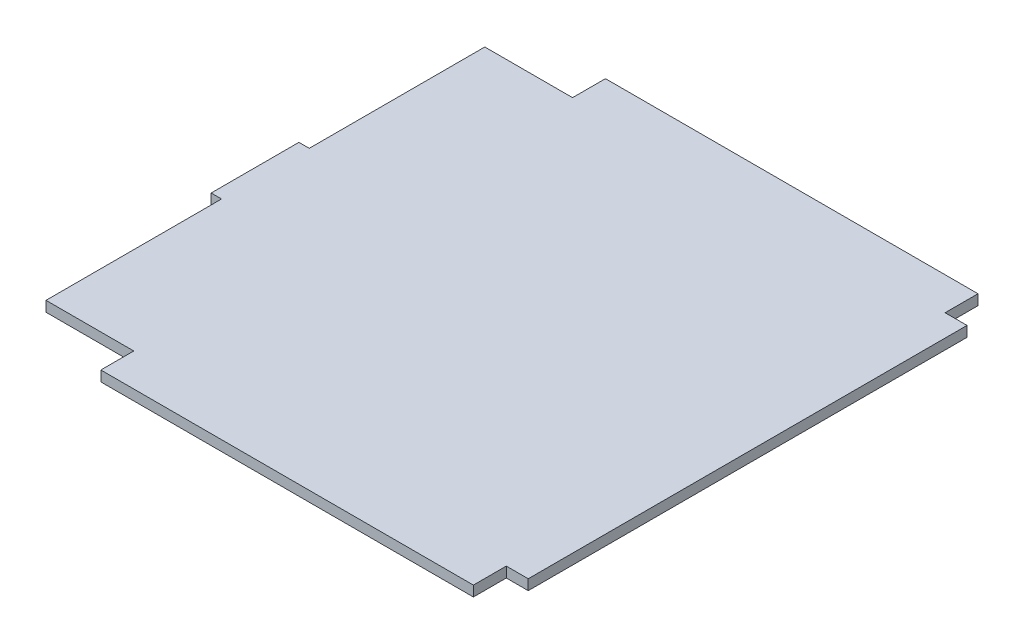
ISO-10303-21;
HEADER;
FILE_DESCRIPTION(('STEP AP214'),'2;1');
FILE_NAME('part.step','',(''),(''),'','','');
FILE_SCHEMA(('AUTOMOTIVE_DESIGN { 1 0 10303 214 1 1 1 1 }'));
ENDSEC;
DATA;
#1=APPLICATION_CONTEXT('core data for automotive mechanical design processes');
#2=APPLICATION_PROTOCOL_DEFINITION('international standard','automotive_design',2000,#1);
#3=PRODUCT_CONTEXT('',#1,'mechanical');
#4=PRODUCT('Part','Part','',(#3));
#5=PRODUCT_RELATED_PRODUCT_CATEGORY('part','',(#4));
#6=PRODUCT_DEFINITION_FORMATION('','',#4);
#7=PRODUCT_DEFINITION_CONTEXT('part definition',#1,'design');
#8=PRODUCT_DEFINITION('design','',#6,#7);
#9=PRODUCT_DEFINITION_SHAPE('','',#8);
#10=(LENGTH_UNIT() NAMED_UNIT(*) SI_UNIT(.MILLI.,.METRE.));
#11=(NAMED_UNIT(*) PLANE_ANGLE_UNIT() SI_UNIT($,.RADIAN.));
#12=(NAMED_UNIT(*) SI_UNIT($,.STERADIAN.) SOLID_ANGLE_UNIT());
#13=UNCERTAINTY_MEASURE_WITH_UNIT(LENGTH_MEASURE(1.E-05),#10,'distance_accuracy_value','');
#14=(GEOMETRIC_REPRESENTATION_CONTEXT(3) GLOBAL_UNCERTAINTY_ASSIGNED_CONTEXT((#13)) GLOBAL_UNIT_ASSIGNED_CONTEXT((#10,
#11,#12)) REPRESENTATION_CONTEXT('',''));
#15=CARTESIAN_POINT('',(0.,0.,0.));
#16=DIRECTION('',(0.,0.,1.));
#17=DIRECTION('',(1.,0.,0.));
#18=AXIS2_PLACEMENT_3D('',#15,#16,#17);
#19=CARTESIAN_POINT('',(0.,2.9972,73.025));
#20=DIRECTION('',(0.,0.,1.));
#21=DIRECTION('',(1.,0.,0.));
#22=AXIS2_PLACEMENT_3D('',#19,#20,#21);
#23=PLANE('',#22);
#24=DIRECTION('',(-1.,0.,0.));
#25=VECTOR('',#24,1.);
#26=CARTESIAN_POINT('',(0.,0.,73.025));
#27=LINE('',#26,#25);
#28=CARTESIAN_POINT('',(63.4365000000001,0.,73.025));
#29=VERTEX_POINT('',#28);
#30=CARTESIAN_POINT('',(-44.3864999999999,0.,73.025));
#31=VERTEX_POINT('',#30);
#32=EDGE_CURVE('E250',#29,#31,#27,.T.);
#33=ORIENTED_EDGE('',*,*,#32,.F.);
#34=DIRECTION('',(0.,-1.,0.));
#35=VECTOR('',#34,1.);
#36=CARTESIAN_POINT('',(63.4365000000001,2.9972,73.025));
#37=LINE('',#36,#35);
#38=CARTESIAN_POINT('',(63.4365000000001,2.9972,73.025));
#39=VERTEX_POINT('',#38);
#40=EDGE_CURVE('E11',#39,#29,#37,.T.);
#41=ORIENTED_EDGE('',*,*,#40,.F.);
#42=DIRECTION('',(-1.,0.,0.));
#43=VECTOR('',#42,1.);
#44=CARTESIAN_POINT('',(0.,2.9972,73.025));
#45=LINE('',#44,#43);
#46=CARTESIAN_POINT('',(-44.3864999999999,2.9972,73.025));
#47=VERTEX_POINT('',#46);
#48=EDGE_CURVE('E205',#39,#47,#45,.T.);
#49=ORIENTED_EDGE('',*,*,#48,.T.);
#50=DIRECTION('',(0.,-1.,0.));
#51=VECTOR('',#50,1.);
#52=CARTESIAN_POINT('',(-44.3864999999999,2.9972,73.025));
#53=LINE('',#52,#51);
#54=EDGE_CURVE('E52',#47,#31,#53,.T.);
#55=ORIENTED_EDGE('',*,*,#54,.T.);
#56=EDGE_LOOP('',(#33,#41,#49,#55));
#57=FACE_BOUND('',#56,.T.);
#58=ADVANCED_FACE('F36',(#57),#23,.T.);
#59=CARTESIAN_POINT('',(63.4365000000001,2.9972,0.));
#60=DIRECTION('',(-1.,0.,0.));
#61=DIRECTION('',(0.,0.,1.));
#62=AXIS2_PLACEMENT_3D('',#59,#60,#61);
#63=PLANE('',#62);
#64=DIRECTION('',(0.,0.,-1.));
#65=VECTOR('',#64,1.);
#66=CARTESIAN_POINT('',(63.4365000000001,0.,0.));
#67=LINE('',#66,#65);
#68=CARTESIAN_POINT('',(63.4365000000001,0.,63.5));
#69=VERTEX_POINT('',#68);
#70=EDGE_CURVE('E248',#29,#69,#67,.T.);
#71=ORIENTED_EDGE('',*,*,#70,.T.);
#72=DIRECTION('',(0.,-1.,0.));
#73=VECTOR('',#72,1.);
#74=CARTESIAN_POINT('',(63.4365000000001,2.9972,63.5));
#75=LINE('',#74,#73);
#76=CARTESIAN_POINT('',(63.4365000000001,2.9972,63.5));
#77=VERTEX_POINT('',#76);
#78=EDGE_CURVE('E44',#77,#69,#75,.T.);
#79=ORIENTED_EDGE('',*,*,#78,.F.);
#80=DIRECTION('',(0.,0.,-1.));
#81=VECTOR('',#80,1.);
#82=CARTESIAN_POINT('',(63.4365000000001,2.9972,0.));
#83=LINE('',#82,#81);
#84=EDGE_CURVE('E203',#39,#77,#83,.T.);
#85=ORIENTED_EDGE('',*,*,#84,.F.);
#86=ORIENTED_EDGE('',*,*,#40,.T.);
#87=EDGE_LOOP('',(#71,#79,#85,#86));
#88=FACE_BOUND('',#87,.T.);
#89=ADVANCED_FACE('F249',(#88),#63,.F.);
#90=CARTESIAN_POINT('',(-5.55111512312574E-13,2.9972,63.4999999999994));
#91=DIRECTION('',(0.,0.,1.));
#92=DIRECTION('',(1.,0.,0.));
#93=AXIS2_PLACEMENT_3D('',#90,#91,#92);
#94=PLANE('',#93);
#95=DIRECTION('',(-1.,0.,0.));
#96=VECTOR('',#95,1.);
#97=CARTESIAN_POINT('',(-5.55111512312574E-13,0.,63.4999999999994));
#98=LINE('',#97,#96);
#99=CARTESIAN_POINT('',(69.7865000000001,0.,63.5));
#100=VERTEX_POINT('',#99);
#101=EDGE_CURVE('E244',#100,#69,#98,.T.);
#102=ORIENTED_EDGE('',*,*,#101,.F.);
#103=DIRECTION('',(0.,-1.,0.));
#104=VECTOR('',#103,1.);
#105=CARTESIAN_POINT('',(69.7865000000001,2.9972,63.5));
#106=LINE('',#105,#104);
#107=CARTESIAN_POINT('',(69.7865000000001,2.9972,63.5));
#108=VERTEX_POINT('',#107);
#109=EDGE_CURVE('E237',#108,#100,#106,.T.);
#110=ORIENTED_EDGE('',*,*,#109,.F.);
#111=DIRECTION('',(-1.,0.,0.));
#112=VECTOR('',#111,1.);
#113=CARTESIAN_POINT('',(-5.55111512312574E-13,2.9972,63.4999999999994));
#114=LINE('',#113,#112);
#115=EDGE_CURVE('E200',#108,#77,#114,.T.);
#116=ORIENTED_EDGE('',*,*,#115,.T.);
#117=ORIENTED_EDGE('',*,*,#78,.T.);
#118=EDGE_LOOP('',(#102,#110,#116,#117));
#119=FACE_BOUND('',#118,.T.);
#120=ADVANCED_FACE('F242',(#119),#94,.T.);
#121=CARTESIAN_POINT('',(69.7865000000001,2.9972,0.));
#122=DIRECTION('',(-1.,0.,0.));
#123=DIRECTION('',(0.,0.,1.));
#124=AXIS2_PLACEMENT_3D('',#121,#122,#123);
#125=PLANE('',#124);
#126=DIRECTION('',(0.,0.,-1.));
#127=VECTOR('',#126,1.);
#128=CARTESIAN_POINT('',(69.7865000000001,0.,0.));
#129=LINE('',#128,#127);
#130=CARTESIAN_POINT('',(69.7865000000001,0.,-63.5));
#131=VERTEX_POINT('',#130);
#132=EDGE_CURVE('E255',#100,#131,#129,.T.);
#133=ORIENTED_EDGE('',*,*,#132,.T.);
#134=DIRECTION('',(0.,-1.,0.));
#135=VECTOR('',#134,1.);
#136=CARTESIAN_POINT('',(69.7865000000001,2.9972,-63.5));
#137=LINE('',#136,#135);
#138=CARTESIAN_POINT('',(69.7865000000001,2.9972,-63.5));
#139=VERTEX_POINT('',#138);
#140=EDGE_CURVE('E234',#139,#131,#137,.T.);
#141=ORIENTED_EDGE('',*,*,#140,.F.);
#142=DIRECTION('',(0.,0.,-1.));
#143=VECTOR('',#142,1.);
#144=CARTESIAN_POINT('',(69.7865000000001,2.9972,0.));
#145=LINE('',#144,#143);
#146=EDGE_CURVE('E198',#108,#139,#145,.T.);
#147=ORIENTED_EDGE('',*,*,#146,.F.);
#148=ORIENTED_EDGE('',*,*,#109,.T.);
#149=EDGE_LOOP('',(#133,#141,#147,#148));
#150=FACE_BOUND('',#149,.T.);
#151=ADVANCED_FACE('F321',(#150),#125,.F.);
#152=CARTESIAN_POINT('',(-2.77555756156288E-13,2.9972,-63.4999999999997));
#153=DIRECTION('',(0.,0.,1.));
#154=DIRECTION('',(1.,0.,0.));
#155=AXIS2_PLACEMENT_3D('',#152,#153,#154);
#156=PLANE('',#155);
#157=DIRECTION('',(-1.,0.,0.));
#158=VECTOR('',#157,1.);
#159=CARTESIAN_POINT('',(-2.77555756156288E-13,0.,-63.4999999999997));
#160=LINE('',#159,#158);
#161=CARTESIAN_POINT('',(63.4365000000001,0.,-63.5));
#162=VERTEX_POINT('',#161);
#163=EDGE_CURVE('E257',#131,#162,#160,.T.);
#164=ORIENTED_EDGE('',*,*,#163,.T.);
#165=DIRECTION('',(0.,-1.,0.));
#166=VECTOR('',#165,1.);
#167=CARTESIAN_POINT('',(63.4365000000001,2.9972,-63.5));
#168=LINE('',#167,#166);
#169=CARTESIAN_POINT('',(63.4365000000001,2.9972,-63.5));
#170=VERTEX_POINT('',#169);
#171=EDGE_CURVE('E232',#170,#162,#168,.T.);
#172=ORIENTED_EDGE('',*,*,#171,.F.);
#173=DIRECTION('',(-1.,0.,0.));
#174=VECTOR('',#173,1.);
#175=CARTESIAN_POINT('',(-2.77555756156288E-13,2.9972,-63.4999999999997));
#176=LINE('',#175,#174);
#177=EDGE_CURVE('E196',#139,#170,#176,.T.);
#178=ORIENTED_EDGE('',*,*,#177,.F.);
#179=ORIENTED_EDGE('',*,*,#140,.T.);
#180=EDGE_LOOP('',(#164,#172,#178,#179));
#181=FACE_BOUND('',#180,.T.);
#182=ADVANCED_FACE('F316',(#181),#156,.F.);
#183=CARTESIAN_POINT('',(63.4365000000001,2.9972,0.));
#184=DIRECTION('',(1.,0.,0.));
#185=DIRECTION('',(0.,0.,-1.));
#186=AXIS2_PLACEMENT_3D('',#183,#184,#185);
#187=PLANE('',#186);
#188=DIRECTION('',(0.,0.,1.));
#189=VECTOR('',#188,1.);
#190=CARTESIAN_POINT('',(63.4365000000001,0.,0.));
#191=LINE('',#190,#189);
#192=CARTESIAN_POINT('',(63.4365000000001,0.,-73.025));
#193=VERTEX_POINT('',#192);
#194=EDGE_CURVE('E263',#193,#162,#191,.T.);
#195=ORIENTED_EDGE('',*,*,#194,.F.);
#196=DIRECTION('',(0.,-1.,0.));
#197=VECTOR('',#196,1.);
#198=CARTESIAN_POINT('',(63.4365000000001,2.9972,-73.025));
#199=LINE('',#198,#197);
#200=CARTESIAN_POINT('',(63.4365000000001,2.9972,-73.025));
#201=VERTEX_POINT('',#200);
#202=EDGE_CURVE('E230',#201,#193,#199,.T.);
#203=ORIENTED_EDGE('',*,*,#202,.F.);
#204=DIRECTION('',(0.,0.,1.));
#205=VECTOR('',#204,1.);
#206=CARTESIAN_POINT('',(63.4365000000001,2.9972,0.));
#207=LINE('',#206,#205);
#208=EDGE_CURVE('E193',#201,#170,#207,.T.);
#209=ORIENTED_EDGE('',*,*,#208,.T.);
#210=ORIENTED_EDGE('',*,*,#171,.T.);
#211=EDGE_LOOP('',(#195,#203,#209,#210));
#212=FACE_BOUND('',#211,.T.);
#213=ADVANCED_FACE('F313',(#212),#187,.T.);
#214=CARTESIAN_POINT('',(0.,2.9972,-73.025));
#215=DIRECTION('',(0.,0.,1.));
#216=DIRECTION('',(1.,0.,0.));
#217=AXIS2_PLACEMENT_3D('',#214,#215,#216);
#218=PLANE('',#217);
#219=DIRECTION('',(-1.,0.,0.));
#220=VECTOR('',#219,1.);
#221=CARTESIAN_POINT('',(0.,0.,-73.025));
#222=LINE('',#221,#220);
#223=CARTESIAN_POINT('',(-44.3864999999999,0.,-73.025));
#224=VERTEX_POINT('',#223);
#225=EDGE_CURVE('E266',#193,#224,#222,.T.);
#226=ORIENTED_EDGE('',*,*,#225,.T.);
#227=DIRECTION('',(0.,-1.,0.));
#228=VECTOR('',#227,1.);
#229=CARTESIAN_POINT('',(-44.3864999999999,2.9972,-73.025));
#230=LINE('',#229,#228);
#231=CARTESIAN_POINT('',(-44.3864999999999,2.9972,-73.025));
#232=VERTEX_POINT('',#231);
#233=EDGE_CURVE('E227',#232,#224,#230,.T.);
#234=ORIENTED_EDGE('',*,*,#233,.F.);
#235=DIRECTION('',(-1.,0.,0.));
#236=VECTOR('',#235,1.);
#237=CARTESIAN_POINT('',(0.,2.9972,-73.025));
#238=LINE('',#237,#236);
#239=EDGE_CURVE('E189',#201,#232,#238,.T.);
#240=ORIENTED_EDGE('',*,*,#239,.F.);
#241=ORIENTED_EDGE('',*,*,#202,.T.);
#242=EDGE_LOOP('',(#226,#234,#240,#241));
#243=FACE_BOUND('',#242,.T.);
#244=ADVANCED_FACE('F310',(#243),#218,.F.);
#245=CARTESIAN_POINT('',(-44.3864999999999,2.9972,0.));
#246=DIRECTION('',(1.,0.,0.));
#247=DIRECTION('',(0.,0.,-1.));
#248=AXIS2_PLACEMENT_3D('',#245,#246,#247);
#249=PLANE('',#248);
#250=DIRECTION('',(0.,0.,1.));
#251=VECTOR('',#250,1.);
#252=CARTESIAN_POINT('',(-44.3864999999999,0.,0.));
#253=LINE('',#252,#251);
#254=CARTESIAN_POINT('',(-44.3864999999999,0.,-63.5));
#255=VERTEX_POINT('',#254);
#256=EDGE_CURVE('E268',#224,#255,#253,.T.);
#257=ORIENTED_EDGE('',*,*,#256,.T.);
#258=DIRECTION('',(0.,-1.,0.));
#259=VECTOR('',#258,1.);
#260=CARTESIAN_POINT('',(-44.3864999999999,2.9972,-63.5));
#261=LINE('',#260,#259);
#262=CARTESIAN_POINT('',(-44.3864999999999,2.9972,-63.5));
#263=VERTEX_POINT('',#262);
#264=EDGE_CURVE('E225',#263,#255,#261,.T.);
#265=ORIENTED_EDGE('',*,*,#264,.F.);
#266=DIRECTION('',(0.,0.,1.));
#267=VECTOR('',#266,1.);
#268=CARTESIAN_POINT('',(-44.3864999999999,2.9972,0.));
#269=LINE('',#268,#267);
#270=EDGE_CURVE('E186',#232,#263,#269,.T.);
#271=ORIENTED_EDGE('',*,*,#270,.F.);
#272=ORIENTED_EDGE('',*,*,#233,.T.);
#273=EDGE_LOOP('',(#257,#265,#271,#272));
#274=FACE_BOUND('',#273,.T.);
#275=ADVANCED_FACE('F305',(#274),#249,.F.);
#276=CARTESIAN_POINT('',(0.,2.9972,-63.5));
#277=DIRECTION('',(0.,0.,-1.));
#278=DIRECTION('',(-1.,0.,0.));
#279=AXIS2_PLACEMENT_3D('',#276,#277,#278);
#280=PLANE('',#279);
#281=DIRECTION('',(1.,0.,0.));
#282=VECTOR('',#281,1.);
#283=CARTESIAN_POINT('',(0.,0.,-63.5));
#284=LINE('',#283,#282);
#285=CARTESIAN_POINT('',(-69.7865,0.,-63.5));
#286=VERTEX_POINT('',#285);
#287=EDGE_CURVE('E271',#286,#255,#284,.T.);
#288=ORIENTED_EDGE('',*,*,#287,.F.);
#289=DIRECTION('',(0.,-1.,0.));
#290=VECTOR('',#289,1.);
#291=CARTESIAN_POINT('',(-69.7865,2.9972,-63.5));
#292=LINE('',#291,#290);
#293=CARTESIAN_POINT('',(-69.7865,2.9972,-63.5));
#294=VERTEX_POINT('',#293);
#295=EDGE_CURVE('E223',#294,#286,#292,.T.);
#296=ORIENTED_EDGE('',*,*,#295,.F.);
#297=DIRECTION('',(1.,0.,0.));
#298=VECTOR('',#297,1.);
#299=CARTESIAN_POINT('',(0.,2.9972,-63.5));
#300=LINE('',#299,#298);
#301=EDGE_CURVE('E182',#294,#263,#300,.T.);
#302=ORIENTED_EDGE('',*,*,#301,.T.);
#303=ORIENTED_EDGE('',*,*,#264,.T.);
#304=EDGE_LOOP('',(#288,#296,#302,#303));
#305=FACE_BOUND('',#304,.T.);
#306=ADVANCED_FACE('F299',(#305),#280,.T.);
#307=CARTESIAN_POINT('',(-69.7864999999999,2.9972,0.));
#308=DIRECTION('',(-1.,0.,0.));
#309=DIRECTION('',(0.,0.,1.));
#310=AXIS2_PLACEMENT_3D('',#307,#308,#309);
#311=PLANE('',#310);
#312=DIRECTION('',(0.,0.,-1.));
#313=VECTOR('',#312,1.);
#314=CARTESIAN_POINT('',(-69.7864999999999,0.,0.));
#315=LINE('',#314,#313);
#316=CARTESIAN_POINT('',(-69.7864999999999,0.,-12.7));
#317=VERTEX_POINT('',#316);
#318=EDGE_CURVE('E274',#317,#286,#315,.T.);
#319=ORIENTED_EDGE('',*,*,#318,.F.);
#320=DIRECTION('',(0.,-1.,0.));
#321=VECTOR('',#320,1.);
#322=CARTESIAN_POINT('',(-69.7864999999999,2.9972,-12.7));
#323=LINE('',#322,#321);
#324=CARTESIAN_POINT('',(-69.7864999999999,2.9972,-12.7));
#325=VERTEX_POINT('',#324);
#326=EDGE_CURVE('E221',#325,#317,#323,.T.);
#327=ORIENTED_EDGE('',*,*,#326,.F.);
#328=DIRECTION('',(0.,0.,-1.));
#329=VECTOR('',#328,1.);
#330=CARTESIAN_POINT('',(-69.7864999999999,2.9972,0.));
#331=LINE('',#330,#329);
#332=EDGE_CURVE('E175',#325,#294,#331,.T.);
#333=ORIENTED_EDGE('',*,*,#332,.T.);
#334=ORIENTED_EDGE('',*,*,#295,.T.);
#335=EDGE_LOOP('',(#319,#327,#333,#334));
#336=FACE_BOUND('',#335,.T.);
#337=ADVANCED_FACE('F297',(#336),#311,.T.);
#338=CARTESIAN_POINT('',(0.,2.9972,-12.6999999999999));
#339=DIRECTION('',(0.,0.,1.));
#340=DIRECTION('',(1.,0.,0.));
#341=AXIS2_PLACEMENT_3D('',#338,#339,#340);
#342=PLANE('',#341);
#343=DIRECTION('',(-1.,0.,0.));
#344=VECTOR('',#343,1.);
#345=CARTESIAN_POINT('',(0.,0.,-12.6999999999999));
#346=LINE('',#345,#344);
#347=CARTESIAN_POINT('',(-72.7836999999999,0.,-12.7));
#348=VERTEX_POINT('',#347);
#349=EDGE_CURVE('E277',#317,#348,#346,.T.);
#350=ORIENTED_EDGE('',*,*,#349,.T.);
#351=DIRECTION('',(0.,-1.,0.));
#352=VECTOR('',#351,1.);
#353=CARTESIAN_POINT('',(-72.7836999999999,2.9972,-12.7));
#354=LINE('',#353,#352);
#355=CARTESIAN_POINT('',(-72.7836999999999,2.9972,-12.7));
#356=VERTEX_POINT('',#355);
#357=EDGE_CURVE('E219',#356,#348,#354,.T.);
#358=ORIENTED_EDGE('',*,*,#357,.F.);
#359=DIRECTION('',(-1.,0.,0.));
#360=VECTOR('',#359,1.);
#361=CARTESIAN_POINT('',(0.,2.9972,-12.6999999999999));
#362=LINE('',#361,#360);
#363=EDGE_CURVE('E181',#325,#356,#362,.T.);
#364=ORIENTED_EDGE('',*,*,#363,.F.);
#365=ORIENTED_EDGE('',*,*,#326,.T.);
#366=EDGE_LOOP('',(#350,#358,#364,#365));
#367=FACE_BOUND('',#366,.T.);
#368=ADVANCED_FACE('F295',(#367),#342,.F.);
#369=CARTESIAN_POINT('',(-72.7836999999999,2.9972,0.));
#370=DIRECTION('',(-1.,0.,0.));
#371=DIRECTION('',(0.,0.,1.));
#372=AXIS2_PLACEMENT_3D('',#369,#370,#371);
#373=PLANE('',#372);
#374=DIRECTION('',(0.,0.,-1.));
#375=VECTOR('',#374,1.);
#376=CARTESIAN_POINT('',(-72.7836999999999,0.,0.));
#377=LINE('',#376,#375);
#378=CARTESIAN_POINT('',(-72.7836999999999,0.,12.7));
#379=VERTEX_POINT('',#378);
#380=EDGE_CURVE('E280',#379,#348,#377,.T.);
#381=ORIENTED_EDGE('',*,*,#380,.F.);
#382=DIRECTION('',(0.,-1.,0.));
#383=VECTOR('',#382,1.);
#384=CARTESIAN_POINT('',(-72.7836999999999,2.9972,12.7));
#385=LINE('',#384,#383);
#386=CARTESIAN_POINT('',(-72.7836999999999,2.9972,12.7));
#387=VERTEX_POINT('',#386);
#388=EDGE_CURVE('E217',#387,#379,#385,.T.);
#389=ORIENTED_EDGE('',*,*,#388,.F.);
#390=DIRECTION('',(0.,0.,-1.));
#391=VECTOR('',#390,1.);
#392=CARTESIAN_POINT('',(-72.7836999999999,2.9972,0.));
#393=LINE('',#392,#391);
#394=EDGE_CURVE('E176',#387,#356,#393,.T.);
#395=ORIENTED_EDGE('',*,*,#394,.T.);
#396=ORIENTED_EDGE('',*,*,#357,.T.);
#397=EDGE_LOOP('',(#381,#389,#395,#396));
#398=FACE_BOUND('',#397,.T.);
#399=ADVANCED_FACE('F291',(#398),#373,.T.);
#400=CARTESIAN_POINT('',(0.,2.9972,12.7));
#401=DIRECTION('',(0.,0.,1.));
#402=DIRECTION('',(1.,0.,0.));
#403=AXIS2_PLACEMENT_3D('',#400,#401,#402);
#404=PLANE('',#403);
#405=DIRECTION('',(-1.,0.,0.));
#406=VECTOR('',#405,1.);
#407=CARTESIAN_POINT('',(0.,0.,12.7));
#408=LINE('',#407,#406);
#409=CARTESIAN_POINT('',(-69.7864999999999,0.,12.7));
#410=VERTEX_POINT('',#409);
#411=EDGE_CURVE('E282',#410,#379,#408,.T.);
#412=ORIENTED_EDGE('',*,*,#411,.F.);
#413=DIRECTION('',(0.,-1.,0.));
#414=VECTOR('',#413,1.);
#415=CARTESIAN_POINT('',(-69.7864999999999,2.9972,12.7));
#416=LINE('',#415,#414);
#417=CARTESIAN_POINT('',(-69.7864999999999,2.9972,12.7));
#418=VERTEX_POINT('',#417);
#419=EDGE_CURVE('E160',#418,#410,#416,.T.);
#420=ORIENTED_EDGE('',*,*,#419,.F.);
#421=DIRECTION('',(-1.,0.,0.));
#422=VECTOR('',#421,1.);
#423=CARTESIAN_POINT('',(0.,2.9972,12.7));
#424=LINE('',#423,#422);
#425=EDGE_CURVE('E173',#418,#387,#424,.T.);
#426=ORIENTED_EDGE('',*,*,#425,.T.);
#427=ORIENTED_EDGE('',*,*,#388,.T.);
#428=EDGE_LOOP('',(#412,#420,#426,#427));
#429=FACE_BOUND('',#428,.T.);
#430=ADVANCED_FACE('F288',(#429),#404,.T.);
#431=CARTESIAN_POINT('',(-69.7864999999999,0.,63.5));
#432=VERTEX_POINT('',#431);
#433=EDGE_CURVE('E157',#432,#410,#315,.T.);
#434=ORIENTED_EDGE('',*,*,#433,.F.);
#435=DIRECTION('',(0.,-1.,0.));
#436=VECTOR('',#435,1.);
#437=CARTESIAN_POINT('',(-69.7864999999999,2.9972,63.5));
#438=LINE('',#437,#436);
#439=CARTESIAN_POINT('',(-69.7864999999999,2.9972,63.5));
#440=VERTEX_POINT('',#439);
#441=EDGE_CURVE('E151',#440,#432,#438,.T.);
#442=ORIENTED_EDGE('',*,*,#441,.F.);
#443=EDGE_CURVE('E155',#440,#418,#331,.T.);
#444=ORIENTED_EDGE('',*,*,#443,.T.);
#445=ORIENTED_EDGE('',*,*,#419,.T.);
#446=EDGE_LOOP('',(#434,#442,#444,#445));
#447=FACE_BOUND('',#446,.T.);
#448=ADVANCED_FACE('F153',(#447),#311,.T.);
#449=CARTESIAN_POINT('',(0.,2.9972,63.5000000000001));
#450=DIRECTION('',(0.,0.,-1.));
#451=DIRECTION('',(-1.,0.,0.));
#452=AXIS2_PLACEMENT_3D('',#449,#450,#451);
#453=PLANE('',#452);
#454=DIRECTION('',(1.,0.,0.));
#455=VECTOR('',#454,1.);
#456=CARTESIAN_POINT('',(0.,0.,63.5000000000001));
#457=LINE('',#456,#455);
#458=CARTESIAN_POINT('',(-44.3864999999999,0.,63.5));
#459=VERTEX_POINT('',#458);
#460=EDGE_CURVE('E208',#432,#459,#457,.T.);
#461=ORIENTED_EDGE('',*,*,#460,.T.);
#462=DIRECTION('',(0.,-1.,0.));
#463=VECTOR('',#462,1.);
#464=CARTESIAN_POINT('',(-44.3864999999999,2.9972,63.5));
#465=LINE('',#464,#463);
#466=CARTESIAN_POINT('',(-44.3864999999999,2.9972,63.5));
#467=VERTEX_POINT('',#466);
#468=EDGE_CURVE('E102',#467,#459,#465,.T.);
#469=ORIENTED_EDGE('',*,*,#468,.F.);
#470=DIRECTION('',(1.,0.,0.));
#471=VECTOR('',#470,1.);
#472=CARTESIAN_POINT('',(0.,2.9972,63.5000000000001));
#473=LINE('',#472,#471);
#474=EDGE_CURVE('E162',#440,#467,#473,.T.);
#475=ORIENTED_EDGE('',*,*,#474,.F.);
#476=ORIENTED_EDGE('',*,*,#441,.T.);
#477=EDGE_LOOP('',(#461,#469,#475,#476));
#478=FACE_BOUND('',#477,.T.);
#479=ADVANCED_FACE('F163',(#478),#453,.F.);
#480=CARTESIAN_POINT('',(-44.3864999999999,2.9972,0.));
#481=DIRECTION('',(-1.,0.,0.));
#482=DIRECTION('',(0.,0.,1.));
#483=AXIS2_PLACEMENT_3D('',#480,#481,#482);
#484=PLANE('',#483);
#485=DIRECTION('',(0.,0.,-1.));
#486=VECTOR('',#485,1.);
#487=CARTESIAN_POINT('',(-44.3864999999999,0.,0.));
#488=LINE('',#487,#486);
#489=EDGE_CURVE('E206',#31,#459,#488,.T.);
#490=ORIENTED_EDGE('',*,*,#489,.F.);
#491=ORIENTED_EDGE('',*,*,#54,.F.);
#492=DIRECTION('',(0.,0.,-1.));
#493=VECTOR('',#492,1.);
#494=CARTESIAN_POINT('',(-44.3864999999999,2.9972,0.));
#495=LINE('',#494,#493);
#496=EDGE_CURVE('E166',#47,#467,#495,.T.);
#497=ORIENTED_EDGE('',*,*,#496,.T.);
#498=ORIENTED_EDGE('',*,*,#468,.T.);
#499=EDGE_LOOP('',(#490,#491,#497,#498));
#500=FACE_BOUND('',#499,.T.);
#501=ADVANCED_FACE('F323',(#500),#484,.T.);
#502=CARTESIAN_POINT('',(0.,2.9972,0.));
#503=DIRECTION('',(0.,1.,0.));
#504=DIRECTION('',(0.,0.,1.));
#505=AXIS2_PLACEMENT_3D('',#502,#503,#504);
#506=PLANE('',#505);
#507=ORIENTED_EDGE('',*,*,#48,.F.);
#508=ORIENTED_EDGE('',*,*,#84,.T.);
#509=ORIENTED_EDGE('',*,*,#115,.F.);
#510=ORIENTED_EDGE('',*,*,#146,.T.);
#511=ORIENTED_EDGE('',*,*,#177,.T.);
#512=ORIENTED_EDGE('',*,*,#208,.F.);
#513=ORIENTED_EDGE('',*,*,#239,.T.);
#514=ORIENTED_EDGE('',*,*,#270,.T.);
#515=ORIENTED_EDGE('',*,*,#301,.F.);
#516=ORIENTED_EDGE('',*,*,#332,.F.);
#517=ORIENTED_EDGE('',*,*,#363,.T.);
#518=ORIENTED_EDGE('',*,*,#394,.F.);
#519=ORIENTED_EDGE('',*,*,#425,.F.);
#520=ORIENTED_EDGE('',*,*,#443,.F.);
#521=ORIENTED_EDGE('',*,*,#474,.T.);
#522=ORIENTED_EDGE('',*,*,#496,.F.);
#523=EDGE_LOOP('',(#507,#508,#509,#510,#511,#512,#513,#514,#515,#516,#517,#518,#519,#520,#521,#522));
#524=FACE_BOUND('',#523,.T.);
#525=ADVANCED_FACE('F170',(#524),#506,.T.);
#526=CARTESIAN_POINT('',(0.,0.,0.));
#527=DIRECTION('',(0.,1.,0.));
#528=DIRECTION('',(0.,0.,1.));
#529=AXIS2_PLACEMENT_3D('',#526,#527,#528);
#530=PLANE('',#529);
#531=ORIENTED_EDGE('',*,*,#32,.T.);
#532=ORIENTED_EDGE('',*,*,#489,.T.);
#533=ORIENTED_EDGE('',*,*,#460,.F.);
#534=ORIENTED_EDGE('',*,*,#433,.T.);
#535=ORIENTED_EDGE('',*,*,#411,.T.);
#536=ORIENTED_EDGE('',*,*,#380,.T.);
#537=ORIENTED_EDGE('',*,*,#349,.F.);
#538=ORIENTED_EDGE('',*,*,#318,.T.);
#539=ORIENTED_EDGE('',*,*,#287,.T.);
#540=ORIENTED_EDGE('',*,*,#256,.F.);
#541=ORIENTED_EDGE('',*,*,#225,.F.);
#542=ORIENTED_EDGE('',*,*,#194,.T.);
#543=ORIENTED_EDGE('',*,*,#163,.F.);
#544=ORIENTED_EDGE('',*,*,#132,.F.);
#545=ORIENTED_EDGE('',*,*,#101,.T.);
#546=ORIENTED_EDGE('',*,*,#70,.F.);
#547=EDGE_LOOP('',(#531,#532,#533,#534,#535,#536,#537,#538,#539,#540,#541,#542,#543,#544,#545,#546));
#548=FACE_BOUND('',#547,.T.);
#549=ADVANCED_FACE('F253',(#548),#530,.F.);
#550=CLOSED_SHELL('',(#58,#89,#120,#151,#182,#213,#244,#275,#306,#337,#368,#399,#430,#448,#479,
#501,#525,#549));
#551=MANIFOLD_SOLID_BREP('B2',#550);
#552=ADVANCED_BREP_SHAPE_REPRESENTATION('',(#18,#551),#14);
#553=SHAPE_DEFINITION_REPRESENTATION(#9,#552);
ENDSEC;
END-ISO-10303-21;
